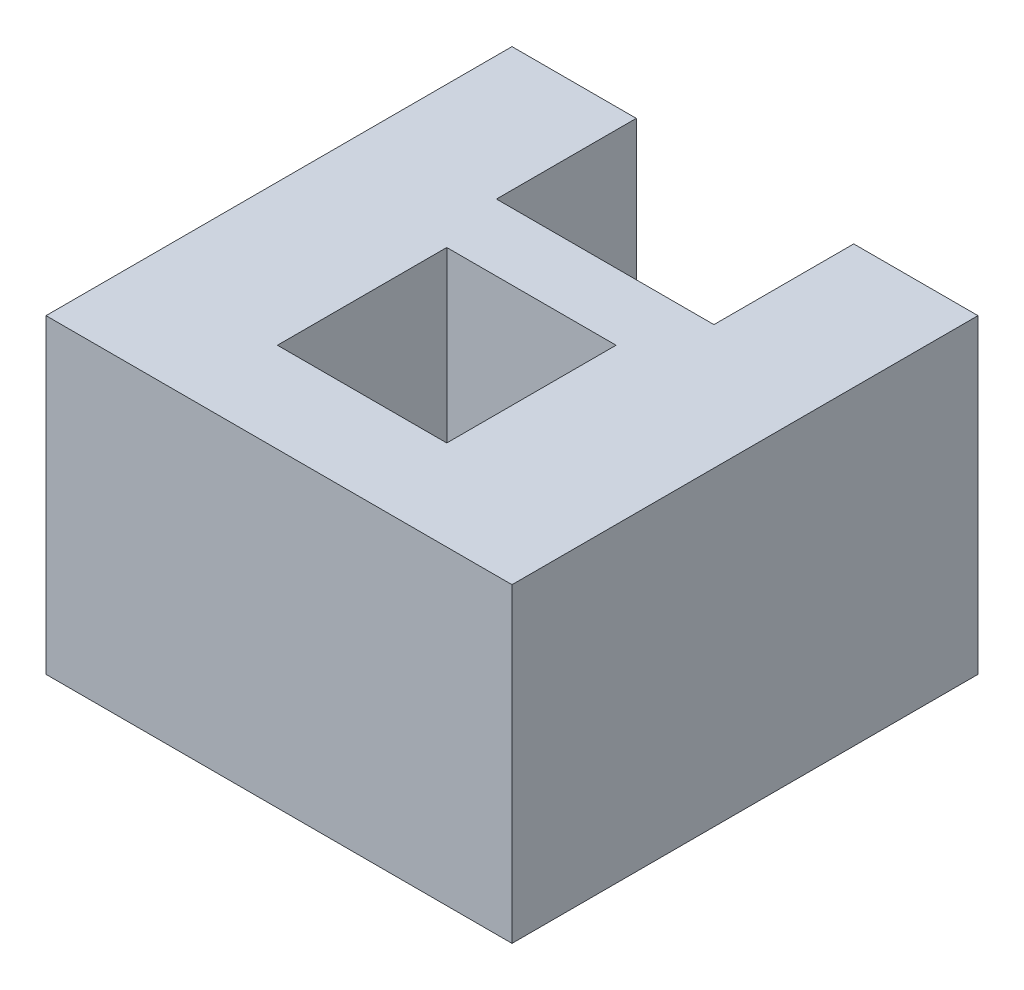
ISO-10303-21;
HEADER;
FILE_DESCRIPTION(('STEP AP214'),'2;1');
FILE_NAME('part.step','',(''),(''),'','','');
FILE_SCHEMA(('AUTOMOTIVE_DESIGN { 1 0 10303 214 1 1 1 1 }'));
ENDSEC;
DATA;
#1=APPLICATION_CONTEXT('core data for automotive mechanical design processes');
#2=APPLICATION_PROTOCOL_DEFINITION('international standard','automotive_design',2000,#1);
#3=PRODUCT_CONTEXT('',#1,'mechanical');
#4=PRODUCT('Part','Part','',(#3));
#5=PRODUCT_RELATED_PRODUCT_CATEGORY('part','',(#4));
#6=PRODUCT_DEFINITION_FORMATION('','',#4);
#7=PRODUCT_DEFINITION_CONTEXT('part definition',#1,'design');
#8=PRODUCT_DEFINITION('design','',#6,#7);
#9=PRODUCT_DEFINITION_SHAPE('','',#8);
#10=(LENGTH_UNIT() NAMED_UNIT(*) SI_UNIT(.MILLI.,.METRE.));
#11=(NAMED_UNIT(*) PLANE_ANGLE_UNIT() SI_UNIT($,.RADIAN.));
#12=(NAMED_UNIT(*) SI_UNIT($,.STERADIAN.) SOLID_ANGLE_UNIT());
#13=UNCERTAINTY_MEASURE_WITH_UNIT(LENGTH_MEASURE(1.E-05),#10,'distance_accuracy_value','');
#14=(GEOMETRIC_REPRESENTATION_CONTEXT(3) GLOBAL_UNCERTAINTY_ASSIGNED_CONTEXT((#13)) GLOBAL_UNIT_ASSIGNED_CONTEXT((#10,
#11,#12)) REPRESENTATION_CONTEXT('',''));
#15=CARTESIAN_POINT('',(0.,0.,0.));
#16=DIRECTION('',(0.,0.,1.));
#17=DIRECTION('',(1.,0.,0.));
#18=AXIS2_PLACEMENT_3D('',#15,#16,#17);
#19=CARTESIAN_POINT('',(-7.5,15.,-0.00999999999999959));
#20=DIRECTION('',(0.,-1.,0.));
#21=DIRECTION('',(0.,0.,-1.));
#22=AXIS2_PLACEMENT_3D('',#19,#20,#21);
#23=PLANE('',#22);
#24=DIRECTION('',(0.,0.,-1.));
#25=VECTOR('',#24,1.);
#26=CARTESIAN_POINT('',(-2.95,15.,0.));
#27=LINE('',#26,#25);
#28=CARTESIAN_POINT('',(-2.95,15.,12.1));
#29=VERTEX_POINT('',#28);
#30=CARTESIAN_POINT('',(-2.95,15.,6.65));
#31=VERTEX_POINT('',#30);
#32=EDGE_CURVE('E230',#29,#31,#27,.T.);
#33=ORIENTED_EDGE('',*,*,#32,.F.);
#34=DIRECTION('',(-1.,0.,0.));
#35=VECTOR('',#34,1.);
#36=CARTESIAN_POINT('',(0.,15.,12.1));
#37=LINE('',#36,#35);
#38=CARTESIAN_POINT('',(2.5,15.,12.1));
#39=VERTEX_POINT('',#38);
#40=EDGE_CURVE('E164',#39,#29,#37,.T.);
#41=ORIENTED_EDGE('',*,*,#40,.F.);
#42=DIRECTION('',(0.,0.,-1.));
#43=VECTOR('',#42,1.);
#44=CARTESIAN_POINT('',(2.5,15.,0.));
#45=LINE('',#44,#43);
#46=CARTESIAN_POINT('',(2.5,15.,6.65));
#47=VERTEX_POINT('',#46);
#48=EDGE_CURVE('E147',#39,#47,#45,.T.);
#49=ORIENTED_EDGE('',*,*,#48,.T.);
#50=DIRECTION('',(-1.,0.,0.));
#51=VECTOR('',#50,1.);
#52=CARTESIAN_POINT('',(0.,15.,6.65));
#53=LINE('',#52,#51);
#54=EDGE_CURVE('E155',#47,#31,#53,.T.);
#55=ORIENTED_EDGE('',*,*,#54,.T.);
#56=EDGE_LOOP('',(#33,#41,#49,#55));
#57=FACE_BOUND('',#56,.T.);
#58=DIRECTION('',(-1.,0.,0.));
#59=VECTOR('',#58,1.);
#60=CARTESIAN_POINT('',(0.,15.,0.));
#61=LINE('',#60,#59);
#62=CARTESIAN_POINT('',(7.5,15.,0.));
#63=VERTEX_POINT('',#62);
#64=CARTESIAN_POINT('',(3.5,15.,0.));
#65=VERTEX_POINT('',#64);
#66=EDGE_CURVE('E247',#63,#65,#61,.T.);
#67=ORIENTED_EDGE('',*,*,#66,.F.);
#68=DIRECTION('',(0.,0.,1.));
#69=VECTOR('',#68,1.);
#70=CARTESIAN_POINT('',(7.5,15.,15.));
#71=LINE('',#70,#69);
#72=CARTESIAN_POINT('',(7.5,15.,15.));
#73=VERTEX_POINT('',#72);
#74=EDGE_CURVE('E250',#63,#73,#71,.T.);
#75=ORIENTED_EDGE('',*,*,#74,.T.);
#76=DIRECTION('',(-1.,0.,0.));
#77=VECTOR('',#76,1.);
#78=CARTESIAN_POINT('',(0.,15.,15.));
#79=LINE('',#78,#77);
#80=CARTESIAN_POINT('',(-7.5,15.,15.));
#81=VERTEX_POINT('',#80);
#82=EDGE_CURVE('E254',#73,#81,#79,.T.);
#83=ORIENTED_EDGE('',*,*,#82,.T.);
#84=DIRECTION('',(0.,0.,1.));
#85=VECTOR('',#84,1.);
#86=CARTESIAN_POINT('',(-7.5,15.,15.));
#87=LINE('',#86,#85);
#88=CARTESIAN_POINT('',(-7.5,15.,0.));
#89=VERTEX_POINT('',#88);
#90=EDGE_CURVE('E243',#89,#81,#87,.T.);
#91=ORIENTED_EDGE('',*,*,#90,.F.);
#92=DIRECTION('',(-1.,0.,0.));
#93=VECTOR('',#92,1.);
#94=CARTESIAN_POINT('',(0.,15.,0.));
#95=LINE('',#94,#93);
#96=CARTESIAN_POINT('',(-3.5,15.,0.));
#97=VERTEX_POINT('',#96);
#98=EDGE_CURVE('E240',#97,#89,#95,.T.);
#99=ORIENTED_EDGE('',*,*,#98,.F.);
#100=DIRECTION('',(0.,0.,1.));
#101=VECTOR('',#100,1.);
#102=CARTESIAN_POINT('',(-3.5,15.,0.));
#103=LINE('',#102,#101);
#104=CARTESIAN_POINT('',(-3.5,15.,4.5));
#105=VERTEX_POINT('',#104);
#106=EDGE_CURVE('E161',#97,#105,#103,.T.);
#107=ORIENTED_EDGE('',*,*,#106,.T.);
#108=DIRECTION('',(-1.,0.,0.));
#109=VECTOR('',#108,1.);
#110=CARTESIAN_POINT('',(0.,15.,4.5));
#111=LINE('',#110,#109);
#112=CARTESIAN_POINT('',(3.5,15.,4.5));
#113=VERTEX_POINT('',#112);
#114=EDGE_CURVE('E233',#113,#105,#111,.T.);
#115=ORIENTED_EDGE('',*,*,#114,.F.);
#116=DIRECTION('',(0.,0.,1.));
#117=VECTOR('',#116,1.);
#118=CARTESIAN_POINT('',(3.5,15.,0.));
#119=LINE('',#118,#117);
#120=EDGE_CURVE('E236',#65,#113,#119,.T.);
#121=ORIENTED_EDGE('',*,*,#120,.F.);
#122=EDGE_LOOP('',(#67,#75,#83,#91,#99,#107,#115,#121));
#123=FACE_BOUND('',#122,.T.);
#124=ADVANCED_FACE('F45',(#57,#123),#23,.T.);
#125=CARTESIAN_POINT('',(-7.5,-25.,15.));
#126=DIRECTION('',(-1.,0.,0.));
#127=DIRECTION('',(0.,0.,1.));
#128=AXIS2_PLACEMENT_3D('',#125,#126,#127);
#129=PLANE('',#128);
#130=DIRECTION('',(0.,1.,0.));
#131=VECTOR('',#130,1.);
#132=CARTESIAN_POINT('',(-7.5,-25.,0.));
#133=LINE('',#132,#131);
#134=CARTESIAN_POINT('',(-7.5,25.,0.));
#135=VERTEX_POINT('',#134);
#136=EDGE_CURVE('E181',#89,#135,#133,.T.);
#137=ORIENTED_EDGE('',*,*,#136,.F.);
#138=ORIENTED_EDGE('',*,*,#90,.T.);
#139=DIRECTION('',(0.,1.,0.));
#140=VECTOR('',#139,1.);
#141=CARTESIAN_POINT('',(-7.5,-25.,15.));
#142=LINE('',#141,#140);
#143=CARTESIAN_POINT('',(-7.5,25.,15.));
#144=VERTEX_POINT('',#143);
#145=EDGE_CURVE('E174',#81,#144,#142,.T.);
#146=ORIENTED_EDGE('',*,*,#145,.T.);
#147=DIRECTION('',(0.,0.,-1.));
#148=VECTOR('',#147,1.);
#149=CARTESIAN_POINT('',(-7.5,25.,15.));
#150=LINE('',#149,#148);
#151=EDGE_CURVE('E173',#144,#135,#150,.T.);
#152=ORIENTED_EDGE('',*,*,#151,.T.);
#153=EDGE_LOOP('',(#137,#138,#146,#152));
#154=FACE_BOUND('',#153,.T.);
#155=ADVANCED_FACE('F290',(#154),#129,.T.);
#156=CARTESIAN_POINT('',(0.,0.,0.));
#157=DIRECTION('',(0.,0.,-1.));
#158=DIRECTION('',(-1.,0.,0.));
#159=AXIS2_PLACEMENT_3D('',#156,#157,#158);
#160=PLANE('',#159);
#161=DIRECTION('',(0.,1.,0.));
#162=VECTOR('',#161,1.);
#163=CARTESIAN_POINT('',(7.5,-25.,0.));
#164=LINE('',#163,#162);
#165=CARTESIAN_POINT('',(7.5,25.,0.));
#166=VERTEX_POINT('',#165);
#167=EDGE_CURVE('E177',#63,#166,#164,.T.);
#168=ORIENTED_EDGE('',*,*,#167,.F.);
#169=ORIENTED_EDGE('',*,*,#66,.T.);
#170=DIRECTION('',(0.,1.,0.));
#171=VECTOR('',#170,1.);
#172=CARTESIAN_POINT('',(3.5,-25.,0.));
#173=LINE('',#172,#171);
#174=CARTESIAN_POINT('',(3.5,25.,0.));
#175=VERTEX_POINT('',#174);
#176=EDGE_CURVE('E94',#65,#175,#173,.T.);
#177=ORIENTED_EDGE('',*,*,#176,.T.);
#178=DIRECTION('',(-1.,0.,0.));
#179=VECTOR('',#178,1.);
#180=CARTESIAN_POINT('',(7.5,25.,0.));
#181=LINE('',#180,#179);
#182=EDGE_CURVE('E180',#166,#175,#181,.T.);
#183=ORIENTED_EDGE('',*,*,#182,.F.);
#184=EDGE_LOOP('',(#168,#169,#177,#183));
#185=FACE_BOUND('',#184,.T.);
#186=ADVANCED_FACE('F268',(#185),#160,.T.);
#187=CARTESIAN_POINT('',(3.5,-25.,0.));
#188=DIRECTION('',(-1.,0.,0.));
#189=DIRECTION('',(0.,0.,1.));
#190=AXIS2_PLACEMENT_3D('',#187,#188,#189);
#191=PLANE('',#190);
#192=ORIENTED_EDGE('',*,*,#176,.F.);
#193=ORIENTED_EDGE('',*,*,#120,.T.);
#194=DIRECTION('',(0.,1.,0.));
#195=VECTOR('',#194,1.);
#196=CARTESIAN_POINT('',(3.5,-25.,4.5));
#197=LINE('',#196,#195);
#198=CARTESIAN_POINT('',(3.5,25.,4.5));
#199=VERTEX_POINT('',#198);
#200=EDGE_CURVE('E195',#113,#199,#197,.T.);
#201=ORIENTED_EDGE('',*,*,#200,.T.);
#202=DIRECTION('',(0.,0.,1.));
#203=VECTOR('',#202,1.);
#204=CARTESIAN_POINT('',(3.5,25.,0.));
#205=LINE('',#204,#203);
#206=EDGE_CURVE('E204',#175,#199,#205,.T.);
#207=ORIENTED_EDGE('',*,*,#206,.F.);
#208=EDGE_LOOP('',(#192,#193,#201,#207));
#209=FACE_BOUND('',#208,.T.);
#210=ADVANCED_FACE('F266',(#209),#191,.T.);
#211=CARTESIAN_POINT('',(0.,-25.,4.5));
#212=DIRECTION('',(0.,0.,-1.));
#213=DIRECTION('',(-1.,0.,0.));
#214=AXIS2_PLACEMENT_3D('',#211,#212,#213);
#215=PLANE('',#214);
#216=ORIENTED_EDGE('',*,*,#200,.F.);
#217=ORIENTED_EDGE('',*,*,#114,.T.);
#218=DIRECTION('',(0.,1.,0.));
#219=VECTOR('',#218,1.);
#220=CARTESIAN_POINT('',(-3.5,-25.,4.5));
#221=LINE('',#220,#219);
#222=CARTESIAN_POINT('',(-3.5,25.,4.5));
#223=VERTEX_POINT('',#222);
#224=EDGE_CURVE('E198',#105,#223,#221,.T.);
#225=ORIENTED_EDGE('',*,*,#224,.T.);
#226=DIRECTION('',(-1.,0.,0.));
#227=VECTOR('',#226,1.);
#228=CARTESIAN_POINT('',(0.,25.,4.5));
#229=LINE('',#228,#227);
#230=EDGE_CURVE('E56',#199,#223,#229,.T.);
#231=ORIENTED_EDGE('',*,*,#230,.F.);
#232=EDGE_LOOP('',(#216,#217,#225,#231));
#233=FACE_BOUND('',#232,.T.);
#234=ADVANCED_FACE('F264',(#233),#215,.T.);
#235=CARTESIAN_POINT('',(0.,-25.,6.65));
#236=DIRECTION('',(0.,0.,-1.));
#237=DIRECTION('',(-1.,0.,0.));
#238=AXIS2_PLACEMENT_3D('',#235,#236,#237);
#239=PLANE('',#238);
#240=ORIENTED_EDGE('',*,*,#54,.F.);
#241=DIRECTION('',(0.,1.,0.));
#242=VECTOR('',#241,1.);
#243=CARTESIAN_POINT('',(2.5,-25.,6.65));
#244=LINE('',#243,#242);
#245=CARTESIAN_POINT('',(2.5,25.,6.65));
#246=VERTEX_POINT('',#245);
#247=EDGE_CURVE('E79',#47,#246,#244,.T.);
#248=ORIENTED_EDGE('',*,*,#247,.T.);
#249=DIRECTION('',(-1.,0.,0.));
#250=VECTOR('',#249,1.);
#251=CARTESIAN_POINT('',(0.,25.,6.65));
#252=LINE('',#251,#250);
#253=CARTESIAN_POINT('',(-2.95,25.,6.65));
#254=VERTEX_POINT('',#253);
#255=EDGE_CURVE('E192',#246,#254,#252,.T.);
#256=ORIENTED_EDGE('',*,*,#255,.T.);
#257=DIRECTION('',(0.,1.,0.));
#258=VECTOR('',#257,1.);
#259=CARTESIAN_POINT('',(-2.95,-25.,6.65));
#260=LINE('',#259,#258);
#261=EDGE_CURVE('E152',#31,#254,#260,.T.);
#262=ORIENTED_EDGE('',*,*,#261,.F.);
#263=EDGE_LOOP('',(#240,#248,#256,#262));
#264=FACE_BOUND('',#263,.T.);
#265=ADVANCED_FACE('F156',(#264),#239,.F.);
#266=CARTESIAN_POINT('',(7.5,25.,15.));
#267=DIRECTION('',(0.,-1.,0.));
#268=DIRECTION('',(0.,0.,-1.));
#269=AXIS2_PLACEMENT_3D('',#266,#267,#268);
#270=PLANE('',#269);
#271=ORIENTED_EDGE('',*,*,#206,.T.);
#272=ORIENTED_EDGE('',*,*,#230,.T.);
#273=DIRECTION('',(0.,0.,1.));
#274=VECTOR('',#273,1.);
#275=CARTESIAN_POINT('',(-3.5,25.,0.));
#276=LINE('',#275,#274);
#277=CARTESIAN_POINT('',(-3.5,25.,0.));
#278=VERTEX_POINT('',#277);
#279=EDGE_CURVE('E11',#278,#223,#276,.T.);
#280=ORIENTED_EDGE('',*,*,#279,.F.);
#281=EDGE_CURVE('E184',#278,#135,#181,.T.);
#282=ORIENTED_EDGE('',*,*,#281,.T.);
#283=ORIENTED_EDGE('',*,*,#151,.F.);
#284=DIRECTION('',(-1.,0.,0.));
#285=VECTOR('',#284,1.);
#286=CARTESIAN_POINT('',(7.5,25.,15.));
#287=LINE('',#286,#285);
#288=CARTESIAN_POINT('',(7.5,25.,15.));
#289=VERTEX_POINT('',#288);
#290=EDGE_CURVE('E172',#289,#144,#287,.T.);
#291=ORIENTED_EDGE('',*,*,#290,.F.);
#292=DIRECTION('',(0.,0.,-1.));
#293=VECTOR('',#292,1.);
#294=CARTESIAN_POINT('',(7.5,25.,15.));
#295=LINE('',#294,#293);
#296=EDGE_CURVE('E229',#289,#166,#295,.T.);
#297=ORIENTED_EDGE('',*,*,#296,.T.);
#298=ORIENTED_EDGE('',*,*,#182,.T.);
#299=EDGE_LOOP('',(#271,#272,#280,#282,#283,#291,#297,#298));
#300=FACE_BOUND('',#299,.T.);
#301=DIRECTION('',(0.,0.,-1.));
#302=VECTOR('',#301,1.);
#303=CARTESIAN_POINT('',(-2.95,25.,0.));
#304=LINE('',#303,#302);
#305=CARTESIAN_POINT('',(-2.95,25.,12.1));
#306=VERTEX_POINT('',#305);
#307=EDGE_CURVE('E196',#306,#254,#304,.T.);
#308=ORIENTED_EDGE('',*,*,#307,.T.);
#309=ORIENTED_EDGE('',*,*,#255,.F.);
#310=DIRECTION('',(0.,0.,-1.));
#311=VECTOR('',#310,1.);
#312=CARTESIAN_POINT('',(2.5,25.,0.));
#313=LINE('',#312,#311);
#314=CARTESIAN_POINT('',(2.5,25.,12.1));
#315=VERTEX_POINT('',#314);
#316=EDGE_CURVE('E149',#315,#246,#313,.T.);
#317=ORIENTED_EDGE('',*,*,#316,.F.);
#318=DIRECTION('',(-1.,0.,0.));
#319=VECTOR('',#318,1.);
#320=CARTESIAN_POINT('',(0.,25.,12.1));
#321=LINE('',#320,#319);
#322=EDGE_CURVE('E220',#315,#306,#321,.T.);
#323=ORIENTED_EDGE('',*,*,#322,.T.);
#324=EDGE_LOOP('',(#308,#309,#317,#323));
#325=FACE_BOUND('',#324,.T.);
#326=ADVANCED_FACE('F274',(#300,#325),#270,.F.);
#327=CARTESIAN_POINT('',(-2.95,-25.,0.));
#328=DIRECTION('',(1.,0.,0.));
#329=DIRECTION('',(0.,0.,-1.));
#330=AXIS2_PLACEMENT_3D('',#327,#328,#329);
#331=PLANE('',#330);
#332=DIRECTION('',(0.,1.,0.));
#333=VECTOR('',#332,1.);
#334=CARTESIAN_POINT('',(-2.95,-25.,12.1));
#335=LINE('',#334,#333);
#336=EDGE_CURVE('E189',#29,#306,#335,.T.);
#337=ORIENTED_EDGE('',*,*,#336,.F.);
#338=ORIENTED_EDGE('',*,*,#32,.T.);
#339=ORIENTED_EDGE('',*,*,#261,.T.);
#340=ORIENTED_EDGE('',*,*,#307,.F.);
#341=EDGE_LOOP('',(#337,#338,#339,#340));
#342=FACE_BOUND('',#341,.T.);
#343=ADVANCED_FACE('F313',(#342),#331,.T.);
#344=CARTESIAN_POINT('',(2.5,-25.,0.));
#345=DIRECTION('',(1.,0.,0.));
#346=DIRECTION('',(0.,0.,-1.));
#347=AXIS2_PLACEMENT_3D('',#344,#345,#346);
#348=PLANE('',#347);
#349=ORIENTED_EDGE('',*,*,#48,.F.);
#350=DIRECTION('',(0.,1.,0.));
#351=VECTOR('',#350,1.);
#352=CARTESIAN_POINT('',(2.5,-25.,12.1));
#353=LINE('',#352,#351);
#354=EDGE_CURVE('E86',#39,#315,#353,.T.);
#355=ORIENTED_EDGE('',*,*,#354,.T.);
#356=ORIENTED_EDGE('',*,*,#316,.T.);
#357=ORIENTED_EDGE('',*,*,#247,.F.);
#358=EDGE_LOOP('',(#349,#355,#356,#357));
#359=FACE_BOUND('',#358,.T.);
#360=ADVANCED_FACE('F145',(#359),#348,.F.);
#361=CARTESIAN_POINT('',(0.,-25.,12.1));
#362=DIRECTION('',(0.,0.,-1.));
#363=DIRECTION('',(-1.,0.,0.));
#364=AXIS2_PLACEMENT_3D('',#361,#362,#363);
#365=PLANE('',#364);
#366=ORIENTED_EDGE('',*,*,#354,.F.);
#367=ORIENTED_EDGE('',*,*,#40,.T.);
#368=ORIENTED_EDGE('',*,*,#336,.T.);
#369=ORIENTED_EDGE('',*,*,#322,.F.);
#370=EDGE_LOOP('',(#366,#367,#368,#369));
#371=FACE_BOUND('',#370,.T.);
#372=ADVANCED_FACE('F47',(#371),#365,.T.);
#373=DIRECTION('',(0.,1.,0.));
#374=VECTOR('',#373,1.);
#375=CARTESIAN_POINT('',(-3.5,-25.,0.));
#376=LINE('',#375,#374);
#377=EDGE_CURVE('E49',#97,#278,#376,.T.);
#378=ORIENTED_EDGE('',*,*,#377,.F.);
#379=ORIENTED_EDGE('',*,*,#98,.T.);
#380=ORIENTED_EDGE('',*,*,#136,.T.);
#381=ORIENTED_EDGE('',*,*,#281,.F.);
#382=EDGE_LOOP('',(#378,#379,#380,#381));
#383=FACE_BOUND('',#382,.T.);
#384=ADVANCED_FACE('F310',(#383),#160,.T.);
#385=CARTESIAN_POINT('',(-3.5,-25.,0.));
#386=DIRECTION('',(-1.,0.,0.));
#387=DIRECTION('',(0.,0.,1.));
#388=AXIS2_PLACEMENT_3D('',#385,#386,#387);
#389=PLANE('',#388);
#390=ORIENTED_EDGE('',*,*,#106,.F.);
#391=ORIENTED_EDGE('',*,*,#377,.T.);
#392=ORIENTED_EDGE('',*,*,#279,.T.);
#393=ORIENTED_EDGE('',*,*,#224,.F.);
#394=EDGE_LOOP('',(#390,#391,#392,#393));
#395=FACE_BOUND('',#394,.T.);
#396=ADVANCED_FACE('F262',(#395),#389,.F.);
#397=CARTESIAN_POINT('',(7.5,-25.,15.));
#398=DIRECTION('',(-1.,0.,0.));
#399=DIRECTION('',(0.,0.,1.));
#400=AXIS2_PLACEMENT_3D('',#397,#398,#399);
#401=PLANE('',#400);
#402=ORIENTED_EDGE('',*,*,#74,.F.);
#403=ORIENTED_EDGE('',*,*,#167,.T.);
#404=ORIENTED_EDGE('',*,*,#296,.F.);
#405=DIRECTION('',(0.,1.,0.));
#406=VECTOR('',#405,1.);
#407=CARTESIAN_POINT('',(7.5,-25.,15.));
#408=LINE('',#407,#406);
#409=EDGE_CURVE('E169',#73,#289,#408,.T.);
#410=ORIENTED_EDGE('',*,*,#409,.F.);
#411=EDGE_LOOP('',(#402,#403,#404,#410));
#412=FACE_BOUND('',#411,.T.);
#413=ADVANCED_FACE('F272',(#412),#401,.F.);
#414=CARTESIAN_POINT('',(0.,0.,15.));
#415=DIRECTION('',(0.,0.,-1.));
#416=DIRECTION('',(-1.,0.,0.));
#417=AXIS2_PLACEMENT_3D('',#414,#415,#416);
#418=PLANE('',#417);
#419=ORIENTED_EDGE('',*,*,#82,.F.);
#420=ORIENTED_EDGE('',*,*,#409,.T.);
#421=ORIENTED_EDGE('',*,*,#290,.T.);
#422=ORIENTED_EDGE('',*,*,#145,.F.);
#423=EDGE_LOOP('',(#419,#420,#421,#422));
#424=FACE_BOUND('',#423,.T.);
#425=ADVANCED_FACE('F293',(#424),#418,.F.);
#426=CLOSED_SHELL('',(#124,#155,#186,#210,#234,#265,#326,#343,#360,#372,#384,#396,#413,#425));
#427=MANIFOLD_SOLID_BREP('B2',#426);
#428=ADVANCED_BREP_SHAPE_REPRESENTATION('',(#18,#427),#14);
#429=SHAPE_DEFINITION_REPRESENTATION(#9,#428);
ENDSEC;
END-ISO-10303-21;
